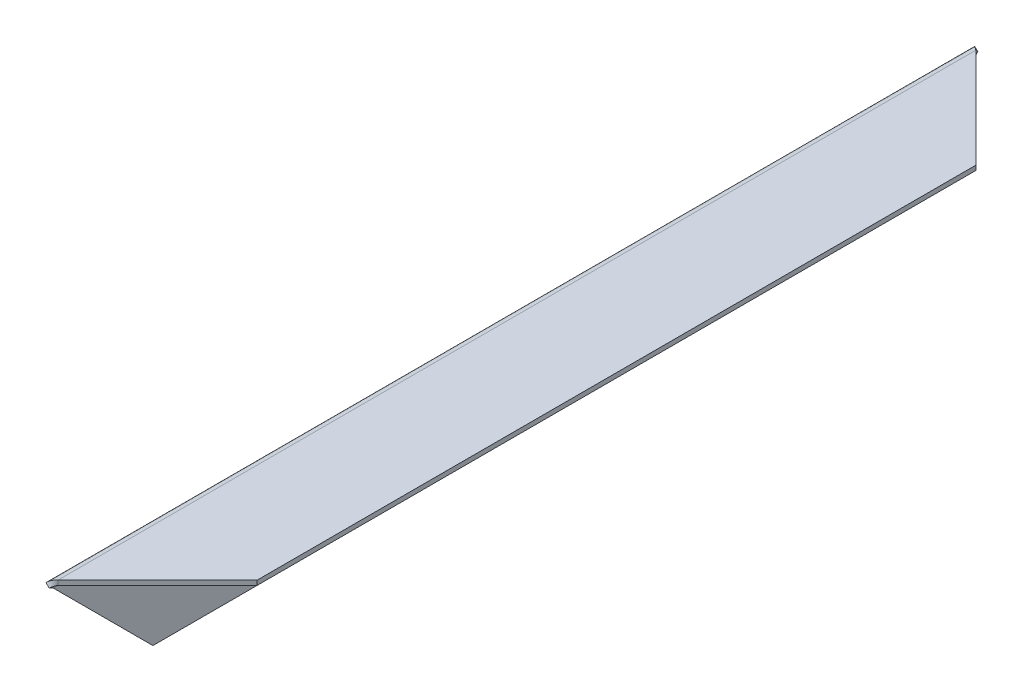
ISO-10303-21;
HEADER;
FILE_DESCRIPTION(('STEP AP214'),'2;1');
FILE_NAME('part.step','',(''),(''),'','','');
FILE_SCHEMA(('AUTOMOTIVE_DESIGN { 1 0 10303 214 1 1 1 1 }'));
ENDSEC;
DATA;
#1=APPLICATION_CONTEXT('core data for automotive mechanical design processes');
#2=APPLICATION_PROTOCOL_DEFINITION('international standard','automotive_design',2000,#1);
#3=PRODUCT_CONTEXT('',#1,'mechanical');
#4=PRODUCT('Part','Part','',(#3));
#5=PRODUCT_RELATED_PRODUCT_CATEGORY('part','',(#4));
#6=PRODUCT_DEFINITION_FORMATION('','',#4);
#7=PRODUCT_DEFINITION_CONTEXT('part definition',#1,'design');
#8=PRODUCT_DEFINITION('design','',#6,#7);
#9=PRODUCT_DEFINITION_SHAPE('','',#8);
#10=(LENGTH_UNIT() NAMED_UNIT(*) SI_UNIT(.MILLI.,.METRE.));
#11=(NAMED_UNIT(*) PLANE_ANGLE_UNIT() SI_UNIT($,.RADIAN.));
#12=(NAMED_UNIT(*) SI_UNIT($,.STERADIAN.) SOLID_ANGLE_UNIT());
#13=UNCERTAINTY_MEASURE_WITH_UNIT(LENGTH_MEASURE(1.E-05),#10,'distance_accuracy_value','');
#14=(GEOMETRIC_REPRESENTATION_CONTEXT(3) GLOBAL_UNCERTAINTY_ASSIGNED_CONTEXT((#13)) GLOBAL_UNIT_ASSIGNED_CONTEXT((#10,
#11,#12)) REPRESENTATION_CONTEXT('',''));
#15=CARTESIAN_POINT('',(0.,0.,0.));
#16=DIRECTION('',(0.,0.,1.));
#17=DIRECTION('',(1.,0.,0.));
#18=AXIS2_PLACEMENT_3D('',#15,#16,#17);
#19=CARTESIAN_POINT('',(-75.3461789999995,0.188336430725022,0.));
#20=DIRECTION('',(-1.,0.,0.));
#21=DIRECTION('',(0.,0.,1.));
#22=AXIS2_PLACEMENT_3D('',#19,#20,#21);
#23=PLANE('',#22);
#24=DIRECTION('',(0.,-0.707106781186615,-0.70710678118648));
#25=VECTOR('',#24,1.);
#26=CARTESIAN_POINT('',(-75.346179,74.7407654307376,74.5524289999984));
#27=LINE('',#26,#25);
#28=CARTESIAN_POINT('',(-75.346179,73.8729789999997,73.6846425692607));
#29=VERTEX_POINT('',#28);
#30=CARTESIAN_POINT('',(-75.3461789999999,57.8815154307375,57.6931790000015));
#31=VERTEX_POINT('',#30);
#32=EDGE_CURVE('E54',#29,#31,#27,.T.);
#33=ORIENTED_EDGE('',*,*,#32,.F.);
#34=DIRECTION('',(0.,0.,-1.));
#35=VECTOR('',#34,1.);
#36=CARTESIAN_POINT('',(-75.346179,73.8729789999997,0.));
#37=LINE('',#36,#35);
#38=CARTESIAN_POINT('',(-75.346179,73.8729789999998,-73.6846425692606));
#39=VERTEX_POINT('',#38);
#40=EDGE_CURVE('E47',#29,#39,#37,.T.);
#41=ORIENTED_EDGE('',*,*,#40,.T.);
#42=DIRECTION('',(0.,0.707106781186615,-0.70710678118648));
#43=VECTOR('',#42,1.);
#44=CARTESIAN_POINT('',(-75.346179,74.7407654307376,-74.5524289999983));
#45=LINE('',#44,#43);
#46=CARTESIAN_POINT('',(-75.3461789999999,57.8815154307376,-57.6931790000015));
#47=VERTEX_POINT('',#46);
#48=EDGE_CURVE('E62',#47,#39,#45,.T.);
#49=ORIENTED_EDGE('',*,*,#48,.F.);
#50=DIRECTION('',(0.,0.,-1.));
#51=VECTOR('',#50,1.);
#52=CARTESIAN_POINT('',(-75.3461789999999,57.8815154307375,57.6931790000015));
#53=LINE('',#52,#51);
#54=EDGE_CURVE('E431',#31,#47,#53,.T.);
#55=ORIENTED_EDGE('',*,*,#54,.F.);
#56=EDGE_LOOP('',(#33,#41,#49,#55));
#57=FACE_BOUND('',#56,.T.);
#58=ADVANCED_FACE('F35',(#57),#23,.T.);
#59=CARTESIAN_POINT('',(-74.6095790000001,74.7407654307376,74.5524289999984));
#60=DIRECTION('',(0.,0.70710678118648,-0.707106781186615));
#61=DIRECTION('',(0.,0.707106781186615,0.70710678118648));
#62=AXIS2_PLACEMENT_3D('',#59,#60,#61);
#63=PLANE('',#62);
#64=CARTESIAN_POINT('',(-75.346179,73.8729789999997,73.6846425692607));
#65=CARTESIAN_POINT('',(-74.6095790000001,73.8729789999997,73.6846425692607));
#66=B_SPLINE_CURVE_WITH_KNOTS('',1,(#64,#65),.UNSPECIFIED.,.F.,.F.,(2,2),(0.,1.),.UNSPECIFIED.);
#67=CARTESIAN_POINT('',(-74.6095790000001,73.8729789999997,73.6846425692607));
#68=VERTEX_POINT('',#67);
#69=EDGE_CURVE('E11',#29,#68,#66,.T.);
#70=ORIENTED_EDGE('',*,*,#69,.F.);
#71=ORIENTED_EDGE('',*,*,#32,.T.);
#72=DIRECTION('',(-1.,0.,0.));
#73=VECTOR('',#72,1.);
#74=CARTESIAN_POINT('',(-74.6095789999999,57.8815154307375,57.6931790000015));
#75=LINE('',#74,#73);
#76=CARTESIAN_POINT('',(-74.6095789999999,57.8815154307375,57.6931790000015));
#77=VERTEX_POINT('',#76);
#78=EDGE_CURVE('E474',#77,#31,#75,.T.);
#79=ORIENTED_EDGE('',*,*,#78,.F.);
#80=DIRECTION('',(0.,-0.707106781186615,-0.70710678118648));
#81=VECTOR('',#80,1.);
#82=CARTESIAN_POINT('',(-74.6095790000001,74.7407654307376,74.5524289999984));
#83=LINE('',#82,#81);
#84=EDGE_CURVE('E278',#68,#77,#83,.T.);
#85=ORIENTED_EDGE('',*,*,#84,.F.);
#86=EDGE_LOOP('',(#70,#71,#79,#85));
#87=FACE_BOUND('',#86,.T.);
#88=ADVANCED_FACE('F37',(#87),#63,.F.);
#89=CARTESIAN_POINT('',(-74.6095789999999,57.8815154307375,57.6931790000015));
#90=DIRECTION('',(0.,1.,0.));
#91=DIRECTION('',(0.,0.,1.));
#92=AXIS2_PLACEMENT_3D('',#89,#90,#91);
#93=PLANE('',#92);
#94=ORIENTED_EDGE('',*,*,#54,.T.);
#95=DIRECTION('',(-1.,0.,0.));
#96=VECTOR('',#95,1.);
#97=CARTESIAN_POINT('',(-74.6095789999999,57.8815154307376,-57.6931790000015));
#98=LINE('',#97,#96);
#99=CARTESIAN_POINT('',(-74.6095789999999,57.8815154307376,-57.6931790000015));
#100=VERTEX_POINT('',#99);
#101=EDGE_CURVE('E472',#100,#47,#98,.T.);
#102=ORIENTED_EDGE('',*,*,#101,.F.);
#103=DIRECTION('',(0.,0.,-1.));
#104=VECTOR('',#103,1.);
#105=CARTESIAN_POINT('',(-74.6095789999999,57.8815154307375,57.6931790000015));
#106=LINE('',#105,#104);
#107=EDGE_CURVE('E470',#77,#100,#106,.T.);
#108=ORIENTED_EDGE('',*,*,#107,.F.);
#109=ORIENTED_EDGE('',*,*,#78,.T.);
#110=EDGE_LOOP('',(#94,#102,#108,#109));
#111=FACE_BOUND('',#110,.T.);
#112=ADVANCED_FACE('F256',(#111),#93,.F.);
#113=CARTESIAN_POINT('',(-74.609579,74.7407654307376,-74.5524289999983));
#114=DIRECTION('',(0.,0.70710678118648,0.707106781186615));
#115=DIRECTION('',(0.,-0.707106781186615,0.70710678118648));
#116=AXIS2_PLACEMENT_3D('',#113,#114,#115);
#117=PLANE('',#116);
#118=CARTESIAN_POINT('',(-74.609579,73.8729789999998,-73.6846425692607));
#119=CARTESIAN_POINT('',(-75.346179,73.8729789999998,-73.6846425692607));
#120=B_SPLINE_CURVE_WITH_KNOTS('',1,(#118,#119),.UNSPECIFIED.,.F.,.F.,(2,2),(0.,1.),.UNSPECIFIED.);
#121=CARTESIAN_POINT('',(-74.609579,73.8729789999998,-73.6846425692607));
#122=VERTEX_POINT('',#121);
#123=EDGE_CURVE('E290',#122,#39,#120,.T.);
#124=ORIENTED_EDGE('',*,*,#123,.F.);
#125=DIRECTION('',(0.,0.707106781186615,-0.70710678118648));
#126=VECTOR('',#125,1.);
#127=CARTESIAN_POINT('',(-74.609579,74.7407654307376,-74.5524289999983));
#128=LINE('',#127,#126);
#129=EDGE_CURVE('E467',#100,#122,#128,.T.);
#130=ORIENTED_EDGE('',*,*,#129,.F.);
#131=ORIENTED_EDGE('',*,*,#101,.T.);
#132=ORIENTED_EDGE('',*,*,#48,.T.);
#133=EDGE_LOOP('',(#124,#130,#131,#132));
#134=FACE_BOUND('',#133,.T.);
#135=ADVANCED_FACE('F259',(#134),#117,.F.);
#136=CARTESIAN_POINT('',(-74.6095789999995,0.188336430725022,0.));
#137=DIRECTION('',(-1.,0.,0.));
#138=DIRECTION('',(0.,0.,1.));
#139=AXIS2_PLACEMENT_3D('',#136,#137,#138);
#140=PLANE('',#139);
#141=DIRECTION('',(0.,0.,-1.));
#142=VECTOR('',#141,1.);
#143=CARTESIAN_POINT('',(-74.609579,73.8729789999997,0.));
#144=LINE('',#143,#142);
#145=EDGE_CURVE('E468',#68,#122,#144,.T.);
#146=ORIENTED_EDGE('',*,*,#145,.F.);
#147=ORIENTED_EDGE('',*,*,#84,.T.);
#148=ORIENTED_EDGE('',*,*,#107,.T.);
#149=ORIENTED_EDGE('',*,*,#129,.T.);
#150=EDGE_LOOP('',(#146,#147,#148,#149));
#151=FACE_BOUND('',#150,.T.);
#152=ADVANCED_FACE('F261',(#151),#140,.F.);
#153=CARTESIAN_POINT('',(-57.8815154307379,74.6095789999998,57.6931790000015));
#154=DIRECTION('',(-1.,0.,0.));
#155=DIRECTION('',(0.,0.,-1.));
#156=AXIS2_PLACEMENT_3D('',#153,#154,#155);
#157=PLANE('',#156);
#158=DIRECTION('',(0.,0.,1.));
#159=VECTOR('',#158,1.);
#160=CARTESIAN_POINT('',(-57.8815154307379,75.3461789999998,57.6931790000015));
#161=LINE('',#160,#159);
#162=CARTESIAN_POINT('',(-57.8815154307379,75.3461789999998,-57.6931790000015));
#163=VERTEX_POINT('',#162);
#164=CARTESIAN_POINT('',(-57.8815154307379,75.3461789999998,57.6931790000015));
#165=VERTEX_POINT('',#164);
#166=EDGE_CURVE('E401',#163,#165,#161,.T.);
#167=ORIENTED_EDGE('',*,*,#166,.T.);
#168=DIRECTION('',(0.,1.,0.));
#169=VECTOR('',#168,1.);
#170=CARTESIAN_POINT('',(-57.8815154307379,74.6095789999998,57.6931790000015));
#171=LINE('',#170,#169);
#172=CARTESIAN_POINT('',(-57.8815154307379,74.6095789999998,57.6931790000015));
#173=VERTEX_POINT('',#172);
#174=EDGE_CURVE('E428',#173,#165,#171,.T.);
#175=ORIENTED_EDGE('',*,*,#174,.F.);
#176=DIRECTION('',(0.,0.,1.));
#177=VECTOR('',#176,1.);
#178=CARTESIAN_POINT('',(-57.8815154307379,74.6095789999998,57.6931790000015));
#179=LINE('',#178,#177);
#180=CARTESIAN_POINT('',(-57.8815154307379,74.6095789999998,-57.6931790000015));
#181=VERTEX_POINT('',#180);
#182=EDGE_CURVE('E223',#181,#173,#179,.T.);
#183=ORIENTED_EDGE('',*,*,#182,.F.);
#184=DIRECTION('',(0.,1.,0.));
#185=VECTOR('',#184,1.);
#186=CARTESIAN_POINT('',(-57.8815154307379,74.6095789999998,-57.6931790000015));
#187=LINE('',#186,#185);
#188=EDGE_CURVE('E221',#181,#163,#187,.T.);
#189=ORIENTED_EDGE('',*,*,#188,.T.);
#190=EDGE_LOOP('',(#167,#175,#183,#189));
#191=FACE_BOUND('',#190,.T.);
#192=ADVANCED_FACE('F263',(#191),#157,.F.);
#193=CARTESIAN_POINT('',(-149.29319443075,74.6095789999995,0.));
#194=DIRECTION('',(0.,1.,0.));
#195=DIRECTION('',(0.,0.,1.));
#196=AXIS2_PLACEMENT_3D('',#193,#194,#195);
#197=PLANE('',#196);
#198=DIRECTION('',(-0.707106781186614,0.,0.707106781186481));
#199=VECTOR('',#198,1.);
#200=CARTESIAN_POINT('',(-74.7407654307379,74.6095789999997,74.5524289999984));
#201=LINE('',#200,#199);
#202=CARTESIAN_POINT('',(-73.872979,74.6095789999997,73.6846425692607));
#203=VERTEX_POINT('',#202);
#204=EDGE_CURVE('E212',#173,#203,#201,.T.);
#205=ORIENTED_EDGE('',*,*,#204,.T.);
#206=DIRECTION('',(0.,0.,-1.));
#207=VECTOR('',#206,1.);
#208=CARTESIAN_POINT('',(-73.872979,74.6095789999997,0.));
#209=LINE('',#208,#207);
#210=CARTESIAN_POINT('',(-73.872979,74.6095789999998,-73.6846425692607));
#211=VERTEX_POINT('',#210);
#212=EDGE_CURVE('E152',#203,#211,#209,.T.);
#213=ORIENTED_EDGE('',*,*,#212,.T.);
#214=DIRECTION('',(0.707106781186614,0.,0.707106781186481));
#215=VECTOR('',#214,1.);
#216=CARTESIAN_POINT('',(-74.7407654307379,74.6095789999998,-74.5524289999983));
#217=LINE('',#216,#215);
#218=EDGE_CURVE('E209',#211,#181,#217,.T.);
#219=ORIENTED_EDGE('',*,*,#218,.T.);
#220=ORIENTED_EDGE('',*,*,#182,.T.);
#221=EDGE_LOOP('',(#205,#213,#219,#220));
#222=FACE_BOUND('',#221,.T.);
#223=ADVANCED_FACE('F208',(#222),#197,.F.);
#224=CARTESIAN_POINT('',(-74.7407654307379,74.6095789999998,-74.5524289999983));
#225=DIRECTION('',(-0.707106781186481,0.,0.707106781186614));
#226=DIRECTION('',(-0.707106781186614,0.,-0.707106781186481));
#227=AXIS2_PLACEMENT_3D('',#224,#225,#226);
#228=PLANE('',#227);
#229=ORIENTED_EDGE('',*,*,#218,.F.);
#230=CARTESIAN_POINT('',(-73.872979,75.3461789999998,-73.6846425692607));
#231=CARTESIAN_POINT('',(-73.872979,74.6095789999998,-73.6846425692607));
#232=B_SPLINE_CURVE_WITH_KNOTS('',1,(#230,#231),.UNSPECIFIED.,.F.,.F.,(2,2),(0.,1.),.UNSPECIFIED.);
#233=CARTESIAN_POINT('',(-73.872979,75.3461789999998,-73.6846425692606));
#234=VERTEX_POINT('',#233);
#235=EDGE_CURVE('E218',#211,#234,#232,.F.);
#236=ORIENTED_EDGE('',*,*,#235,.T.);
#237=DIRECTION('',(0.707106781186614,0.,0.707106781186481));
#238=VECTOR('',#237,1.);
#239=CARTESIAN_POINT('',(-74.7407654307379,75.3461789999998,-74.5524289999983));
#240=LINE('',#239,#238);
#241=EDGE_CURVE('E404',#234,#163,#240,.T.);
#242=ORIENTED_EDGE('',*,*,#241,.T.);
#243=ORIENTED_EDGE('',*,*,#188,.F.);
#244=EDGE_LOOP('',(#229,#236,#242,#243));
#245=FACE_BOUND('',#244,.T.);
#246=ADVANCED_FACE('F217',(#245),#228,.F.);
#247=CARTESIAN_POINT('',(-149.29319443075,75.3461789999995,0.));
#248=DIRECTION('',(0.,1.,0.));
#249=DIRECTION('',(0.,0.,1.));
#250=AXIS2_PLACEMENT_3D('',#247,#248,#249);
#251=PLANE('',#250);
#252=DIRECTION('',(0.,0.,-1.));
#253=VECTOR('',#252,1.);
#254=CARTESIAN_POINT('',(-73.872979,75.3461789999998,0.));
#255=LINE('',#254,#253);
#256=CARTESIAN_POINT('',(-73.8729790000001,75.3461789999997,73.6846425692607));
#257=VERTEX_POINT('',#256);
#258=EDGE_CURVE('E132',#257,#234,#255,.T.);
#259=ORIENTED_EDGE('',*,*,#258,.F.);
#260=DIRECTION('',(-0.707106781186614,0.,0.707106781186481));
#261=VECTOR('',#260,1.);
#262=CARTESIAN_POINT('',(-74.7407654307379,75.3461789999997,74.5524289999984));
#263=LINE('',#262,#261);
#264=EDGE_CURVE('E242',#165,#257,#263,.T.);
#265=ORIENTED_EDGE('',*,*,#264,.F.);
#266=ORIENTED_EDGE('',*,*,#166,.F.);
#267=ORIENTED_EDGE('',*,*,#241,.F.);
#268=EDGE_LOOP('',(#259,#265,#266,#267));
#269=FACE_BOUND('',#268,.T.);
#270=ADVANCED_FACE('F254',(#269),#251,.T.);
#271=CARTESIAN_POINT('',(-74.7407654307379,74.6095789999997,74.5524289999984));
#272=DIRECTION('',(-0.707106781186481,0.,-0.707106781186614));
#273=DIRECTION('',(0.707106781186614,0.,-0.707106781186481));
#274=AXIS2_PLACEMENT_3D('',#271,#272,#273);
#275=PLANE('',#274);
#276=ORIENTED_EDGE('',*,*,#264,.T.);
#277=CARTESIAN_POINT('',(-73.872979,74.6095789999997,73.6846425692607));
#278=CARTESIAN_POINT('',(-73.8729790000001,75.3461789999997,73.6846425692607));
#279=B_SPLINE_CURVE_WITH_KNOTS('',1,(#277,#278),.UNSPECIFIED.,.F.,.F.,(2,2),(0.,1.),.UNSPECIFIED.);
#280=EDGE_CURVE('E237',#257,#203,#279,.F.);
#281=ORIENTED_EDGE('',*,*,#280,.T.);
#282=ORIENTED_EDGE('',*,*,#204,.F.);
#283=ORIENTED_EDGE('',*,*,#174,.T.);
#284=EDGE_LOOP('',(#276,#281,#282,#283));
#285=FACE_BOUND('',#284,.T.);
#286=ADVANCED_FACE('F244',(#285),#275,.F.);
#287=CARTESIAN_POINT('',(-74.9146887100441,74.9146887100437,74.5524289999984));
#288=CARTESIAN_POINT('',(-75.0510639267768,74.778313493311,74.4077812391921));
#289=CARTESIAN_POINT('',(-75.1602411073236,74.6149104818821,74.2631668564191));
#290=CARTESIAN_POINT('',(-75.3078355472678,74.2585859832378,73.9739047128399));
#291=CARTESIAN_POINT('',(-75.346179,74.0658426810747,73.8292903300669));
#292=CARTESIAN_POINT('',(-75.346179,73.8729789999997,73.6846425692607));
#293=CARTESIAN_POINT('',(-74.3938338550221,74.3938338550217,74.5524289999984));
#294=CARTESIAN_POINT('',(-74.4620173784557,74.3256503315881,74.4077899046431));
#295=CARTESIAN_POINT('',(-74.5166100536618,74.2439447409409,74.2631668564191));
#296=CARTESIAN_POINT('',(-74.5904072736339,74.0657824916188,73.9739047128399));
#297=CARTESIAN_POINT('',(-74.6095790000001,73.9694050635699,73.829281664616));
#298=CARTESIAN_POINT('',(-74.6095790000001,73.8729789999997,73.6846425692607));
#299=B_SPLINE_SURFACE_WITH_KNOTS('',1,3,((#287,#288,#289,#290,#291,#292),(#293,#294,#295,#296,
#297,#298)),.UNSPECIFIED.,.F.,.F.,.F.,(2,2),(4,2,4),(0.,1.),(0.,0.5,1.),.UNSPECIFIED.);
#300=CARTESIAN_POINT('',(-74.9146887100441,74.9146887100437,74.5524289999984));
#301=CARTESIAN_POINT('',(-74.3938338550221,74.3938338550217,74.5524289999984));
#302=B_SPLINE_CURVE_WITH_KNOTS('',1,(#300,#301),.UNSPECIFIED.,.F.,.F.,(2,2),(0.,1.),.UNSPECIFIED.);
#303=CARTESIAN_POINT('',(-74.9146889457465,74.9146884743413,74.5524287499982));
#304=VERTEX_POINT('',#303);
#305=CARTESIAN_POINT('',(-74.3938338550221,74.3938338550217,74.5524289999984));
#306=VERTEX_POINT('',#305);
#307=EDGE_CURVE('E117',#304,#306,#302,.T.);
#308=CARTESIAN_POINT('',(-74.9146887100441,74.9146887100437,74.5524289999984));
#309=CARTESIAN_POINT('',(-75.0510639267768,74.778313493311,74.4077812391921));
#310=CARTESIAN_POINT('',(-75.1602411073236,74.6149104818821,74.2631668564191));
#311=CARTESIAN_POINT('',(-75.3078355472678,74.2585859832378,73.9739047128399));
#312=CARTESIAN_POINT('',(-75.346179,74.0658426810747,73.8292903300669));
#313=CARTESIAN_POINT('',(-75.346179,73.8729789999997,73.6846425692607));
#314=B_SPLINE_CURVE_WITH_KNOTS('',3,(#308,#309,#310,#311,#312,#313),.UNSPECIFIED.,.F.,.F.,(4,2,
4),(0.,0.5,1.),.UNSPECIFIED.);
#315=EDGE_CURVE('E284',#304,#29,#314,.T.);
#316=CARTESIAN_POINT('',(-74.6095790000001,73.8729789999997,73.6846425692607));
#317=CARTESIAN_POINT('',(-74.6095790000001,73.9694050635699,73.829281664616));
#318=CARTESIAN_POINT('',(-74.5904072736339,74.0657824916188,73.9739047128399));
#319=CARTESIAN_POINT('',(-74.5166100536618,74.2439447409409,74.2631668564191));
#320=CARTESIAN_POINT('',(-74.4620173784557,74.3256503315881,74.4077899046431));
#321=CARTESIAN_POINT('',(-74.3938338550221,74.3938338550217,74.5524289999984));
#322=B_SPLINE_CURVE_WITH_KNOTS('',3,(#316,#317,#318,#319,#320,#321),.UNSPECIFIED.,.F.,.F.,(4,2,
4),(0.,0.5,1.),.UNSPECIFIED.);
#323=EDGE_CURVE('E137',#306,#68,#322,.F.);
#324=ORIENTED_EDGE('',*,*,#307,.F.);
#325=ORIENTED_EDGE('',*,*,#315,.T.);
#326=ORIENTED_EDGE('',*,*,#69,.T.);
#327=ORIENTED_EDGE('',*,*,#323,.F.);
#328=EDGE_LOOP('',(#324,#325,#326,#327));
#329=FACE_BOUND('',#328,.T.);
#330=ADVANCED_FACE('F139',(#329),#299,.F.);
#331=CARTESIAN_POINT('',(-75.346179,73.8729789999998,-73.6846425692607));
#332=CARTESIAN_POINT('',(-75.346179,74.0658426810747,-73.8292903300669));
#333=CARTESIAN_POINT('',(-75.3078355472678,74.2585859832379,-73.9739047128399));
#334=CARTESIAN_POINT('',(-75.1602411073235,74.6149104818822,-74.2631668564191));
#335=CARTESIAN_POINT('',(-75.0510639267768,74.7783134933111,-74.4077812391921));
#336=CARTESIAN_POINT('',(-74.9146887100441,74.9146887100438,-74.5524289999983));
#337=CARTESIAN_POINT('',(-74.609579,73.8729789999998,-73.6846425692607));
#338=CARTESIAN_POINT('',(-74.609579,73.96940506357,-73.829281664616));
#339=CARTESIAN_POINT('',(-74.5904072736339,74.0657824916188,-73.9739047128399));
#340=CARTESIAN_POINT('',(-74.5166100536618,74.243944740941,-74.2631668564191));
#341=CARTESIAN_POINT('',(-74.4620173784557,74.3256503315882,-74.407789904643));
#342=CARTESIAN_POINT('',(-74.3938338550221,74.3938338550218,-74.5524289999983));
#343=B_SPLINE_SURFACE_WITH_KNOTS('',1,3,((#331,#332,#333,#334,#335,#336),(#337,#338,#339,#340,
#341,#342)),.UNSPECIFIED.,.F.,.F.,.F.,(2,2),(4,2,4),(0.,1.),(0.,0.5,1.),.UNSPECIFIED.);
#344=CARTESIAN_POINT('',(-75.346179,73.8729789999998,-73.6846425692607));
#345=CARTESIAN_POINT('',(-75.346179,74.0658426810747,-73.8292903300669));
#346=CARTESIAN_POINT('',(-75.3078355472678,74.2585859832379,-73.9739047128399));
#347=CARTESIAN_POINT('',(-75.1602411073235,74.6149104818822,-74.2631668564191));
#348=CARTESIAN_POINT('',(-75.0510639267768,74.7783134933111,-74.4077812391921));
#349=CARTESIAN_POINT('',(-74.9146887100441,74.9146887100438,-74.5524289999983));
#350=B_SPLINE_CURVE_WITH_KNOTS('',3,(#344,#345,#346,#347,#348,#349),.UNSPECIFIED.,.F.,.F.,(4,2,
4),(0.,0.5,1.),.UNSPECIFIED.);
#351=CARTESIAN_POINT('',(-74.9146889457464,74.9146884743413,-74.5524287499982));
#352=VERTEX_POINT('',#351);
#353=EDGE_CURVE('E287',#39,#352,#350,.T.);
#354=CARTESIAN_POINT('',(-74.9146887100441,74.9146887100438,-74.5524289999983));
#355=CARTESIAN_POINT('',(-74.3938338550221,74.3938338550218,-74.5524289999983));
#356=B_SPLINE_CURVE_WITH_KNOTS('',1,(#354,#355),.UNSPECIFIED.,.F.,.F.,(2,2),(0.,1.),.UNSPECIFIED.);
#357=CARTESIAN_POINT('',(-74.3938338550221,74.3938338550218,-74.5524289999983));
#358=VERTEX_POINT('',#357);
#359=EDGE_CURVE('E133',#352,#358,#356,.T.);
#360=CARTESIAN_POINT('',(-74.3938338550221,74.3938338550218,-74.5524289999983));
#361=CARTESIAN_POINT('',(-74.4620173784557,74.3256503315882,-74.407789904643));
#362=CARTESIAN_POINT('',(-74.5166100536618,74.243944740941,-74.2631668564191));
#363=CARTESIAN_POINT('',(-74.5904072736339,74.0657824916188,-73.9739047128399));
#364=CARTESIAN_POINT('',(-74.609579,73.96940506357,-73.829281664616));
#365=CARTESIAN_POINT('',(-74.609579,73.8729789999998,-73.6846425692607));
#366=B_SPLINE_CURVE_WITH_KNOTS('',3,(#360,#361,#362,#363,#364,#365),.UNSPECIFIED.,.F.,.F.,(4,2,
4),(0.,0.5,1.),.UNSPECIFIED.);
#367=EDGE_CURVE('E145',#122,#358,#366,.F.);
#368=ORIENTED_EDGE('',*,*,#123,.T.);
#369=ORIENTED_EDGE('',*,*,#353,.T.);
#370=ORIENTED_EDGE('',*,*,#359,.T.);
#371=ORIENTED_EDGE('',*,*,#367,.F.);
#372=EDGE_LOOP('',(#368,#369,#370,#371));
#373=FACE_BOUND('',#372,.T.);
#374=ADVANCED_FACE('F305',(#373),#343,.F.);
#375=CARTESIAN_POINT('',(-74.9146887100441,74.9146887100438,-74.5524289999983));
#376=CARTESIAN_POINT('',(-74.7783134933113,75.0510639267765,-74.4077812391921));
#377=CARTESIAN_POINT('',(-74.6149104818825,75.1602411073232,-74.2631668564191));
#378=CARTESIAN_POINT('',(-74.2585859832381,75.3078355472675,-73.9739047128399));
#379=CARTESIAN_POINT('',(-74.065842681075,75.3461789999998,-73.8292903300669));
#380=CARTESIAN_POINT('',(-73.872979,75.3461789999998,-73.6846425692607));
#381=CARTESIAN_POINT('',(-74.3938338550221,74.3938338550218,-74.5524289999983));
#382=CARTESIAN_POINT('',(-74.3256503315884,74.4620173784554,-74.407789904643));
#383=CARTESIAN_POINT('',(-74.2439447409412,74.5166100536615,-74.2631668564191));
#384=CARTESIAN_POINT('',(-74.0657824916191,74.5904072736337,-73.9739047128399));
#385=CARTESIAN_POINT('',(-73.9694050635702,74.6095789999998,-73.8292816646159));
#386=CARTESIAN_POINT('',(-73.872979,74.6095789999998,-73.6846425692607));
#387=B_SPLINE_SURFACE_WITH_KNOTS('',1,3,((#375,#376,#377,#378,#379,#380),(#381,#382,#383,#384,
#385,#386)),.UNSPECIFIED.,.F.,.F.,.F.,(2,2),(4,2,4),(0.,1.),(0.,0.5,1.),.UNSPECIFIED.);
#388=CARTESIAN_POINT('',(-74.9146887100441,74.9146887100438,-74.5524289999983));
#389=CARTESIAN_POINT('',(-74.7783134933113,75.0510639267765,-74.4077812391921));
#390=CARTESIAN_POINT('',(-74.6149104818825,75.1602411073232,-74.2631668564191));
#391=CARTESIAN_POINT('',(-74.2585859832381,75.3078355472675,-73.9739047128399));
#392=CARTESIAN_POINT('',(-74.065842681075,75.3461789999998,-73.8292903300669));
#393=CARTESIAN_POINT('',(-73.872979,75.3461789999998,-73.6846425692607));
#394=B_SPLINE_CURVE_WITH_KNOTS('',3,(#388,#389,#390,#391,#392,#393),.UNSPECIFIED.,.F.,.F.,(4,2,
4),(0.,0.5,1.),.UNSPECIFIED.);
#395=EDGE_CURVE('E388',#352,#234,#394,.T.);
#396=CARTESIAN_POINT('',(-73.872979,74.6095789999998,-73.6846425692607));
#397=CARTESIAN_POINT('',(-73.9694050635702,74.6095789999998,-73.8292816646159));
#398=CARTESIAN_POINT('',(-74.0657824916191,74.5904072736337,-73.9739047128399));
#399=CARTESIAN_POINT('',(-74.2439447409412,74.5166100536615,-74.2631668564191));
#400=CARTESIAN_POINT('',(-74.3256503315884,74.4620173784554,-74.407789904643));
#401=CARTESIAN_POINT('',(-74.3938338550221,74.3938338550218,-74.5524289999983));
#402=B_SPLINE_CURVE_WITH_KNOTS('',3,(#396,#397,#398,#399,#400,#401),.UNSPECIFIED.,.F.,.F.,(4,2,
4),(0.,0.5,1.),.UNSPECIFIED.);
#403=EDGE_CURVE('E154',#358,#211,#402,.F.);
#404=ORIENTED_EDGE('',*,*,#359,.F.);
#405=ORIENTED_EDGE('',*,*,#395,.T.);
#406=ORIENTED_EDGE('',*,*,#235,.F.);
#407=ORIENTED_EDGE('',*,*,#403,.F.);
#408=EDGE_LOOP('',(#404,#405,#406,#407));
#409=FACE_BOUND('',#408,.T.);
#410=ADVANCED_FACE('F177',(#409),#387,.F.);
#411=CARTESIAN_POINT('',(-73.8729790000001,75.3461789999997,73.6846425692607));
#412=CARTESIAN_POINT('',(-74.065842681075,75.3461789999997,73.8292903300669));
#413=CARTESIAN_POINT('',(-74.2585859832381,75.3078355472675,73.9739047128399));
#414=CARTESIAN_POINT('',(-74.6149104818825,75.1602411073232,74.2631668564191));
#415=CARTESIAN_POINT('',(-74.7783134933114,75.0510639267765,74.4077812391921));
#416=CARTESIAN_POINT('',(-74.9146887100441,74.9146887100437,74.5524289999984));
#417=CARTESIAN_POINT('',(-73.872979,74.6095789999997,73.6846425692607));
#418=CARTESIAN_POINT('',(-73.9694050635703,74.6095789999997,73.829281664616));
#419=CARTESIAN_POINT('',(-74.0657824916191,74.5904072736336,73.9739047128399));
#420=CARTESIAN_POINT('',(-74.2439447409413,74.5166100536615,74.2631668564191));
#421=CARTESIAN_POINT('',(-74.3256503315884,74.4620173784554,74.4077899046431));
#422=CARTESIAN_POINT('',(-74.3938338550221,74.3938338550217,74.5524289999984));
#423=B_SPLINE_SURFACE_WITH_KNOTS('',1,3,((#411,#412,#413,#414,#415,#416),(#417,#418,#419,#420,
#421,#422)),.UNSPECIFIED.,.F.,.F.,.F.,(2,2),(4,2,4),(0.,1.),(0.,0.5,1.),.UNSPECIFIED.);
#424=CARTESIAN_POINT('',(-73.8729790000001,75.3461789999997,73.6846425692607));
#425=CARTESIAN_POINT('',(-74.065842681075,75.3461789999997,73.8292903300669));
#426=CARTESIAN_POINT('',(-74.2585859832381,75.3078355472675,73.9739047128399));
#427=CARTESIAN_POINT('',(-74.6149104818825,75.1602411073232,74.2631668564191));
#428=CARTESIAN_POINT('',(-74.7783134933114,75.0510639267765,74.4077812391921));
#429=CARTESIAN_POINT('',(-74.9146887100441,74.9146887100437,74.5524289999984));
#430=B_SPLINE_CURVE_WITH_KNOTS('',3,(#424,#425,#426,#427,#428,#429),.UNSPECIFIED.,.F.,.F.,(4,2,
4),(0.,0.5,1.),.UNSPECIFIED.);
#431=EDGE_CURVE('E126',#257,#304,#430,.T.);
#432=CARTESIAN_POINT('',(-74.3938338550221,74.3938338550217,74.5524289999984));
#433=CARTESIAN_POINT('',(-74.3256503315884,74.4620173784554,74.4077899046431));
#434=CARTESIAN_POINT('',(-74.2439447409413,74.5166100536615,74.2631668564191));
#435=CARTESIAN_POINT('',(-74.0657824916191,74.5904072736336,73.9739047128399));
#436=CARTESIAN_POINT('',(-73.9694050635703,74.6095789999997,73.829281664616));
#437=CARTESIAN_POINT('',(-73.872979,74.6095789999997,73.6846425692607));
#438=B_SPLINE_CURVE_WITH_KNOTS('',3,(#432,#433,#434,#435,#436,#437),.UNSPECIFIED.,.F.,.F.,(4,2,
4),(0.,0.5,1.),.UNSPECIFIED.);
#439=EDGE_CURVE('E122',#203,#306,#438,.F.);
#440=ORIENTED_EDGE('',*,*,#431,.T.);
#441=ORIENTED_EDGE('',*,*,#307,.T.);
#442=ORIENTED_EDGE('',*,*,#439,.F.);
#443=ORIENTED_EDGE('',*,*,#280,.F.);
#444=EDGE_LOOP('',(#440,#441,#442,#443));
#445=FACE_BOUND('',#444,.T.);
#446=ADVANCED_FACE('F120',(#445),#423,.F.);
#447=CARTESIAN_POINT('',(-73.8729790000001,73.8729789999997,149.116777969203));
#448=DIRECTION('',(0.,0.,-1.));
#449=DIRECTION('',(1.,0.,0.));
#450=AXIS2_PLACEMENT_3D('',#447,#448,#449);
#451=CYLINDRICAL_SURFACE('',#450,0.7366);
#452=ORIENTED_EDGE('',*,*,#212,.F.);
#453=ORIENTED_EDGE('',*,*,#439,.T.);
#454=ORIENTED_EDGE('',*,*,#323,.T.);
#455=ORIENTED_EDGE('',*,*,#145,.T.);
#456=ORIENTED_EDGE('',*,*,#367,.T.);
#457=ORIENTED_EDGE('',*,*,#403,.T.);
#458=EDGE_LOOP('',(#452,#453,#454,#455,#456,#457));
#459=FACE_BOUND('',#458,.T.);
#460=ADVANCED_FACE('F149',(#459),#451,.F.);
#461=CARTESIAN_POINT('',(-73.8729790000001,73.8729789999997,149.116777969203));
#462=DIRECTION('',(0.,0.,-1.));
#463=DIRECTION('',(1.,0.,0.));
#464=AXIS2_PLACEMENT_3D('',#461,#462,#463);
#465=CYLINDRICAL_SURFACE('',#464,1.4732);
#466=ORIENTED_EDGE('',*,*,#258,.T.);
#467=ORIENTED_EDGE('',*,*,#395,.F.);
#468=ORIENTED_EDGE('',*,*,#353,.F.);
#469=ORIENTED_EDGE('',*,*,#40,.F.);
#470=ORIENTED_EDGE('',*,*,#315,.F.);
#471=ORIENTED_EDGE('',*,*,#431,.F.);
#472=EDGE_LOOP('',(#466,#467,#468,#469,#470,#471));
#473=FACE_BOUND('',#472,.T.);
#474=ADVANCED_FACE('F176',(#473),#465,.T.);
#475=CLOSED_SHELL('',(#58,#88,#112,#135,#152,#192,#223,#246,#270,#286,#330,#374,#410,#446,#460,#474));
#476=MANIFOLD_SOLID_BREP('B2',#475);
#477=ADVANCED_BREP_SHAPE_REPRESENTATION('',(#18,#476),#14);
#478=SHAPE_DEFINITION_REPRESENTATION(#9,#477);
ENDSEC;
END-ISO-10303-21;
